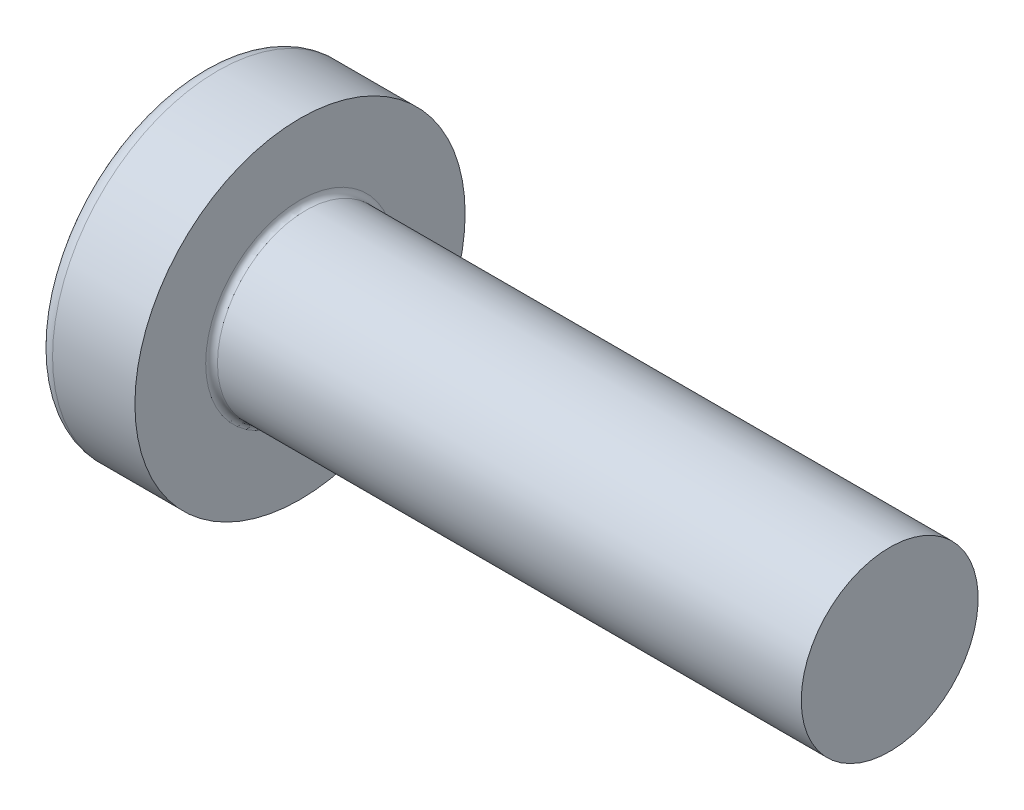
ISO-10303-21;
HEADER;
FILE_DESCRIPTION(('STEP AP214'),'2;1');
FILE_NAME('part.step','',(''),(''),'','','');
FILE_SCHEMA(('AUTOMOTIVE_DESIGN { 1 0 10303 214 1 1 1 1 }'));
ENDSEC;
DATA;
#1=APPLICATION_CONTEXT('core data for automotive mechanical design processes');
#2=APPLICATION_PROTOCOL_DEFINITION('international standard','automotive_design',2000,#1);
#3=PRODUCT_CONTEXT('',#1,'mechanical');
#4=PRODUCT('Part','Part','',(#3));
#5=PRODUCT_RELATED_PRODUCT_CATEGORY('part','',(#4));
#6=PRODUCT_DEFINITION_FORMATION('','',#4);
#7=PRODUCT_DEFINITION_CONTEXT('part definition',#1,'design');
#8=PRODUCT_DEFINITION('design','',#6,#7);
#9=PRODUCT_DEFINITION_SHAPE('','',#8);
#10=(LENGTH_UNIT() NAMED_UNIT(*) SI_UNIT(.MILLI.,.METRE.));
#11=(NAMED_UNIT(*) PLANE_ANGLE_UNIT() SI_UNIT($,.RADIAN.));
#12=(NAMED_UNIT(*) SI_UNIT($,.STERADIAN.) SOLID_ANGLE_UNIT());
#13=UNCERTAINTY_MEASURE_WITH_UNIT(LENGTH_MEASURE(1.E-05),#10,'distance_accuracy_value','');
#14=(GEOMETRIC_REPRESENTATION_CONTEXT(3) GLOBAL_UNCERTAINTY_ASSIGNED_CONTEXT((#13)) GLOBAL_UNIT_ASSIGNED_CONTEXT((#10,
#11,#12)) REPRESENTATION_CONTEXT('',''));
#15=CARTESIAN_POINT('',(0.,0.,0.));
#16=DIRECTION('',(0.,0.,1.));
#17=DIRECTION('',(1.,0.,0.));
#18=AXIS2_PLACEMENT_3D('',#15,#16,#17);
#19=CARTESIAN_POINT('',(5.,0.,0.));
#20=DIRECTION('',(-1.,0.,0.));
#21=DIRECTION('',(0.,1.,0.));
#22=AXIS2_PLACEMENT_3D('',#19,#20,#21);
#23=SPHERICAL_SURFACE('',#22,5.);
#24=CARTESIAN_POINT('',(0.775371598933733,0.,0.));
#25=DIRECTION('',(-1.,0.,0.));
#26=DIRECTION('',(0.,0.,1.));
#27=AXIS2_PLACEMENT_3D('',#24,#25,#26);
#28=CIRCLE('',#27,2.67441860465116);
#29=CARTESIAN_POINT('',(0.775371598933733,0.,2.67441860465116));
#30=VERTEX_POINT('',#29);
#31=EDGE_CURVE('E238',#30,#30,#28,.T.);
#32=ORIENTED_EDGE('',*,*,#31,.T.);
#33=EDGE_LOOP('',(#32));
#34=FACE_BOUND('',#33,.T.);
#35=CARTESIAN_POINT('',(0.0457951200896417,0.,0.));
#36=DIRECTION('',(1.,0.,0.));
#37=DIRECTION('',(0.,0.,-1.));
#38=AXIS2_PLACEMENT_3D('',#35,#36,#37);
#39=CIRCLE('',#38,0.675169614150692);
#40=CARTESIAN_POINT('',(0.0457951200896417,-0.369999999999997,-0.564760133040919));
#41=VERTEX_POINT('',#40);
#42=CARTESIAN_POINT('',(0.0457951200896417,-0.564760133040924,-0.37));
#43=VERTEX_POINT('',#42);
#44=EDGE_CURVE('E374',#41,#43,#39,.F.);
#45=ORIENTED_EDGE('',*,*,#44,.F.);
#46=CARTESIAN_POINT('',(5.,-0.370000000000002,0.));
#47=DIRECTION('',(0.,1.,0.));
#48=DIRECTION('',(0.,0.,1.));
#49=AXIS2_PLACEMENT_3D('',#46,#47,#48);
#50=CIRCLE('',#49,4.98629120689917);
#51=CARTESIAN_POINT('',(0.187869734228639,-0.369999999999995,-1.30633162146802));
#52=VERTEX_POINT('',#51);
#53=EDGE_CURVE('E300',#52,#41,#50,.T.);
#54=ORIENTED_EDGE('',*,*,#53,.F.);
#55=CARTESIAN_POINT('',(4.56358262530798,0.,0.875317983305919));
#56=DIRECTION('',(0.446197753347436,0.,-0.894934391398443));
#57=DIRECTION('',(-0.894934391398443,0.,-0.446197753347436));
#58=AXIS2_PLACEMENT_3D('',#55,#56,#57);
#59=CIRCLE('',#58,4.90340272700175);
#60=CARTESIAN_POINT('',(0.187869734228639,0.370000000000005,-1.30633162146802));
#61=VERTEX_POINT('',#60);
#62=EDGE_CURVE('E272',#52,#61,#59,.T.);
#63=ORIENTED_EDGE('',*,*,#62,.T.);
#64=CARTESIAN_POINT('',(5.,0.369999999999999,0.));
#65=DIRECTION('',(0.,-1.,0.));
#66=DIRECTION('',(0.,0.,-1.));
#67=AXIS2_PLACEMENT_3D('',#64,#65,#66);
#68=CIRCLE('',#67,4.98629120689917);
#69=CARTESIAN_POINT('',(0.0457951200896424,0.370000000000002,-0.564760133040916));
#70=VERTEX_POINT('',#69);
#71=EDGE_CURVE('E327',#70,#61,#68,.T.);
#72=ORIENTED_EDGE('',*,*,#71,.F.);
#73=CARTESIAN_POINT('',(0.0457951200896417,0.564760133040913,-0.37));
#74=VERTEX_POINT('',#73);
#75=EDGE_CURVE('E393',#74,#70,#39,.F.);
#76=ORIENTED_EDGE('',*,*,#75,.F.);
#77=CARTESIAN_POINT('',(5.,0.,-0.369999999999999));
#78=DIRECTION('',(0.,0.,1.));
#79=DIRECTION('',(1.,0.,0.));
#80=AXIS2_PLACEMENT_3D('',#77,#78,#79);
#81=CIRCLE('',#80,4.98629120689917);
#82=CARTESIAN_POINT('',(0.187869734228641,1.30633162146802,-0.37));
#83=VERTEX_POINT('',#82);
#84=EDGE_CURVE('E266',#83,#74,#81,.T.);
#85=ORIENTED_EDGE('',*,*,#84,.F.);
#86=CARTESIAN_POINT('',(4.56358262530798,-0.875317983305921,0.));
#87=DIRECTION('',(0.446197753347436,0.894934391398443,0.));
#88=DIRECTION('',(-0.894934391398443,0.446197753347436,0.));
#89=AXIS2_PLACEMENT_3D('',#86,#87,#88);
#90=CIRCLE('',#89,4.90340272700175);
#91=CARTESIAN_POINT('',(0.187869734228641,1.30633162146802,0.370000000000001));
#92=VERTEX_POINT('',#91);
#93=EDGE_CURVE('E269',#83,#92,#90,.T.);
#94=ORIENTED_EDGE('',*,*,#93,.T.);
#95=CARTESIAN_POINT('',(5.,0.,0.370000000000002));
#96=DIRECTION('',(0.,0.,-1.));
#97=DIRECTION('',(-1.,0.,0.));
#98=AXIS2_PLACEMENT_3D('',#95,#96,#97);
#99=CIRCLE('',#98,4.98629120689917);
#100=CARTESIAN_POINT('',(0.0457951200896417,0.564760133040909,0.369999999999999));
#101=VERTEX_POINT('',#100);
#102=EDGE_CURVE('E262',#101,#92,#99,.T.);
#103=ORIENTED_EDGE('',*,*,#102,.F.);
#104=CARTESIAN_POINT('',(0.0457951200896434,0.369999999999998,0.564760133040918));
#105=VERTEX_POINT('',#104);
#106=EDGE_CURVE('E431',#105,#101,#39,.F.);
#107=ORIENTED_EDGE('',*,*,#106,.F.);
#108=CARTESIAN_POINT('',(0.18786973422864,0.369999999999995,1.30633162146802));
#109=VERTEX_POINT('',#108);
#110=EDGE_CURVE('E282',#109,#105,#68,.T.);
#111=ORIENTED_EDGE('',*,*,#110,.F.);
#112=CARTESIAN_POINT('',(4.56358262530798,0.,-0.87531798330592));
#113=DIRECTION('',(0.446197753347436,0.,0.894934391398443));
#114=DIRECTION('',(0.894934391398443,0.,-0.446197753347436));
#115=AXIS2_PLACEMENT_3D('',#112,#113,#114);
#116=CIRCLE('',#115,4.90340272700175);
#117=CARTESIAN_POINT('',(0.187869734228639,-0.370000000000006,1.30633162146802));
#118=VERTEX_POINT('',#117);
#119=EDGE_CURVE('E49',#109,#118,#116,.T.);
#120=ORIENTED_EDGE('',*,*,#119,.T.);
#121=CARTESIAN_POINT('',(0.0457951200896408,-0.370000000000001,0.564760133040917));
#122=VERTEX_POINT('',#121);
#123=EDGE_CURVE('E279',#122,#118,#50,.T.);
#124=ORIENTED_EDGE('',*,*,#123,.F.);
#125=CARTESIAN_POINT('',(0.0457951200896417,-0.56476013304092,0.369999999999999));
#126=VERTEX_POINT('',#125);
#127=EDGE_CURVE('E392',#126,#122,#39,.F.);
#128=ORIENTED_EDGE('',*,*,#127,.F.);
#129=CARTESIAN_POINT('',(0.187869734228638,-1.30633162146802,0.369999999999999));
#130=VERTEX_POINT('',#129);
#131=EDGE_CURVE('E263',#130,#126,#99,.T.);
#132=ORIENTED_EDGE('',*,*,#131,.F.);
#133=CARTESIAN_POINT('',(4.56358262530798,0.875317983305917,0.));
#134=DIRECTION('',(0.446197753347436,-0.894934391398443,0.));
#135=DIRECTION('',(0.894934391398443,0.446197753347436,0.));
#136=AXIS2_PLACEMENT_3D('',#133,#134,#135);
#137=CIRCLE('',#136,4.90340272700175);
#138=CARTESIAN_POINT('',(0.187869734228638,-1.30633162146802,-0.37));
#139=VERTEX_POINT('',#138);
#140=EDGE_CURVE('E259',#130,#139,#137,.T.);
#141=ORIENTED_EDGE('',*,*,#140,.T.);
#142=EDGE_CURVE('E64',#43,#139,#81,.T.);
#143=ORIENTED_EDGE('',*,*,#142,.F.);
#144=EDGE_LOOP('',(#45,#54,#63,#72,#76,#85,#94,#103,#107,#111,#120,#124,#128,#132,#141,#143));
#145=FACE_BOUND('',#144,.T.);
#146=ADVANCED_FACE('F35',(#34,#145),#23,.T.);
#147=CARTESIAN_POINT('',(1.75,0.527482331818931,-0.37));
#148=DIRECTION('',(0.,0.,1.));
#149=DIRECTION('',(1.,0.,0.));
#150=AXIS2_PLACEMENT_3D('',#147,#148,#149);
#151=PLANE('',#150);
#152=ORIENTED_EDGE('',*,*,#84,.T.);
#153=CARTESIAN_POINT('',(-0.987293237069636,0.649401255968442,-0.37));
#154=CARTESIAN_POINT('',(-0.781914975331302,0.632865887004023,-0.37));
#155=CARTESIAN_POINT('',(-0.576547882405889,0.616188977636102,-0.37));
#156=CARTESIAN_POINT('',(-0.165841599235441,0.582441031964983,-0.37));
#157=CARTESIAN_POINT('',(0.0394975903016328,0.5653699870555,-0.37));
#158=CARTESIAN_POINT('',(0.4501334754206,0.530723441326706,-0.37));
#159=CARTESIAN_POINT('',(0.65543017101234,0.513147940624409,-0.37));
#160=CARTESIAN_POINT('',(1.06596140178858,0.477314957984981,-0.37));
#161=CARTESIAN_POINT('',(1.27119593782008,0.459057485804908,-0.37));
#162=CARTESIAN_POINT('',(1.61065292367297,0.428051938687225,-0.37));
#163=CARTESIAN_POINT('',(1.74490059997313,0.415580824989367,-0.37));
#164=CARTESIAN_POINT('',(2.01334321764434,0.390092023403371,-0.37));
#165=CARTESIAN_POINT('',(2.14753815936247,0.377074339175719,-0.37));
#166=CARTESIAN_POINT('',(2.41586354153627,0.350315629451146,-0.37));
#167=CARTESIAN_POINT('',(2.54999397846979,0.336574568175918,-0.37));
#168=CARTESIAN_POINT('',(2.8181417329714,0.308004077740054,-0.37));
#169=CARTESIAN_POINT('',(2.95215904766802,0.29317462174519,-0.37));
#170=CARTESIAN_POINT('',(3.08609550685347,0.277618485069874,-0.37));
#171=B_SPLINE_CURVE_WITH_KNOTS('',3,(#153,#154,#155,#156,#157,#158,#159,#160,#161,#162,#163,
#164,#165,#166,#167,#168,#169,#170),.UNSPECIFIED.,.F.,.F.,(4,2,2,2,2,2,2,2,4),(0.,
0.61812879398981,1.23627109813549,1.85441325889711,2.47254657920086,2.87702276221884,
3.28149623681437,3.68598973554218,4.09049321035586),.UNSPECIFIED.);
#172=CARTESIAN_POINT('',(1.75,0.415013252800437,-0.37));
#173=VERTEX_POINT('',#172);
#174=EDGE_CURVE('E416',#74,#173,#171,.T.);
#175=ORIENTED_EDGE('',*,*,#174,.T.);
#176=DIRECTION('',(0.,1.,0.));
#177=VECTOR('',#176,1.);
#178=CARTESIAN_POINT('',(1.75,-0.527482331818932,-0.37));
#179=LINE('',#178,#177);
#180=CARTESIAN_POINT('',(1.75,0.527482331818931,-0.37));
#181=VERTEX_POINT('',#180);
#182=EDGE_CURVE('E356',#173,#181,#179,.T.);
#183=ORIENTED_EDGE('',*,*,#182,.T.);
#184=DIRECTION('',(0.894934391398442,-0.446197753347436,0.));
#185=VECTOR('',#184,1.);
#186=CARTESIAN_POINT('',(0.,1.4,-0.37));
#187=LINE('',#186,#185);
#188=EDGE_CURVE('E239',#83,#181,#187,.T.);
#189=ORIENTED_EDGE('',*,*,#188,.F.);
#190=EDGE_LOOP('',(#152,#175,#183,#189));
#191=FACE_BOUND('',#190,.T.);
#192=ADVANCED_FACE('F194',(#191),#151,.T.);
#193=CARTESIAN_POINT('',(1.75,-0.527482331818932,-0.37));
#194=VERTEX_POINT('',#193);
#195=CARTESIAN_POINT('',(1.75,-0.415013252800437,-0.37));
#196=VERTEX_POINT('',#195);
#197=EDGE_CURVE('E247',#194,#196,#179,.T.);
#198=ORIENTED_EDGE('',*,*,#197,.T.);
#199=CARTESIAN_POINT('',(-0.987293237069636,-0.649401255968442,-0.37));
#200=CARTESIAN_POINT('',(-0.781914975331303,-0.632865887004023,-0.37));
#201=CARTESIAN_POINT('',(-0.57654788240589,-0.616188977636102,-0.37));
#202=CARTESIAN_POINT('',(-0.165841599235441,-0.582441031964983,-0.37));
#203=CARTESIAN_POINT('',(0.0394975903016326,-0.5653699870555,-0.37));
#204=CARTESIAN_POINT('',(0.4501334754206,-0.530723441326706,-0.37));
#205=CARTESIAN_POINT('',(0.65543017101234,-0.513147940624409,-0.37));
#206=CARTESIAN_POINT('',(1.06596140178858,-0.477314957984981,-0.37));
#207=CARTESIAN_POINT('',(1.27119593782008,-0.459057485804908,-0.37));
#208=CARTESIAN_POINT('',(1.61065292367297,-0.428051938687225,-0.37));
#209=CARTESIAN_POINT('',(1.74490059997313,-0.415580824989368,-0.37));
#210=CARTESIAN_POINT('',(2.01334321764433,-0.390092023403371,-0.37));
#211=CARTESIAN_POINT('',(2.14753815936247,-0.377074339175718,-0.37));
#212=CARTESIAN_POINT('',(2.41586354153627,-0.350315629451146,-0.37));
#213=CARTESIAN_POINT('',(2.54999397846979,-0.336574568175918,-0.37));
#214=CARTESIAN_POINT('',(2.8181417329714,-0.308004077740054,-0.37));
#215=CARTESIAN_POINT('',(2.95215904766802,-0.29317462174519,-0.37));
#216=CARTESIAN_POINT('',(3.08609550685347,-0.277618485069873,-0.37));
#217=B_SPLINE_CURVE_WITH_KNOTS('',3,(#199,#200,#201,#202,#203,#204,#205,#206,#207,#208,#209,
#210,#211,#212,#213,#214,#215,#216),.UNSPECIFIED.,.F.,.F.,(4,2,2,2,2,2,2,2,4),(0.,
0.61812879398981,1.2362710981355,1.85441325889711,2.47254657920086,2.87702276221884,
3.28149623681437,3.68598973554218,4.09049321035587),.UNSPECIFIED.);
#218=EDGE_CURVE('E391',#196,#43,#217,.F.);
#219=ORIENTED_EDGE('',*,*,#218,.T.);
#220=ORIENTED_EDGE('',*,*,#142,.T.);
#221=DIRECTION('',(0.894934391398443,0.446197753347436,0.));
#222=VECTOR('',#221,1.);
#223=CARTESIAN_POINT('',(0.,-1.4,-0.37));
#224=LINE('',#223,#222);
#225=EDGE_CURVE('E330',#139,#194,#224,.T.);
#226=ORIENTED_EDGE('',*,*,#225,.T.);
#227=EDGE_LOOP('',(#198,#219,#220,#226));
#228=FACE_BOUND('',#227,.T.);
#229=ADVANCED_FACE('F200',(#228),#151,.T.);
#230=CARTESIAN_POINT('',(1.75,-0.527482331818932,0.37));
#231=DIRECTION('',(0.,0.,-1.));
#232=DIRECTION('',(-1.,0.,0.));
#233=AXIS2_PLACEMENT_3D('',#230,#231,#232);
#234=PLANE('',#233);
#235=DIRECTION('',(0.,-1.,0.));
#236=VECTOR('',#235,1.);
#237=CARTESIAN_POINT('',(1.75,0.527482331818931,0.37));
#238=LINE('',#237,#236);
#239=CARTESIAN_POINT('',(1.75,0.527482331818931,0.37));
#240=VERTEX_POINT('',#239);
#241=CARTESIAN_POINT('',(1.75,0.415013252800437,0.37));
#242=VERTEX_POINT('',#241);
#243=EDGE_CURVE('E339',#240,#242,#238,.T.);
#244=ORIENTED_EDGE('',*,*,#243,.T.);
#245=CARTESIAN_POINT('',(-0.987293237053716,0.649401255967162,0.369999999999998));
#246=CARTESIAN_POINT('',(-0.781914975317084,0.632865887002872,0.369999999999998));
#247=CARTESIAN_POINT('',(-0.576547882393372,0.616188977635082,0.369999999999998));
#248=CARTESIAN_POINT('',(-0.165841599226327,0.582441031964228,0.369999999999999));
#249=CARTESIAN_POINT('',(0.0394975903090454,0.56536998705488,0.369999999999999));
#250=CARTESIAN_POINT('',(0.450133475422572,0.530723441326535,0.369999999999999));
#251=CARTESIAN_POINT('',(0.655430171010573,0.513147940624557,0.369999999999999));
#252=CARTESIAN_POINT('',(1.06596140177934,0.477314957985794,0.37));
#253=CARTESIAN_POINT('',(1.2711959378071,0.459057485806066,0.37));
#254=CARTESIAN_POINT('',(1.61065292365626,0.428051938688769,0.37));
#255=CARTESIAN_POINT('',(1.74490059995643,0.415580824990931,0.37));
#256=CARTESIAN_POINT('',(2.01334321762763,0.390092023404979,0.37));
#257=CARTESIAN_POINT('',(2.14753815934577,0.377074339177353,0.37));
#258=CARTESIAN_POINT('',(2.41586354151957,0.350315629452842,0.37));
#259=CARTESIAN_POINT('',(2.5499939784531,0.336574568177649,0.370000000000001));
#260=CARTESIAN_POINT('',(2.81814173295471,0.308004077741874,0.370000000000001));
#261=CARTESIAN_POINT('',(2.95215904765134,0.293174621747063,0.370000000000001));
#262=CARTESIAN_POINT('',(3.0860955068368,0.277618485071814,0.370000000000001));
#263=B_SPLINE_CURVE_WITH_KNOTS('',3,(#245,#246,#247,#248,#249,#250,#251,#252,#253,#254,#255,
#256,#257,#258,#259,#260,#261,#262),.UNSPECIFIED.,.F.,.F.,(4,2,2,2,2,2,2,2,4),(0.,
0.618128793984691,1.23627109812525,1.85441325887562,2.4725465791681,2.87702276218609,
3.28149623678161,3.68598973550942,4.09049321032311),.UNSPECIFIED.);
#264=EDGE_CURVE('E432',#242,#101,#263,.F.);
#265=ORIENTED_EDGE('',*,*,#264,.T.);
#266=ORIENTED_EDGE('',*,*,#102,.T.);
#267=DIRECTION('',(0.894934391398442,-0.446197753347436,0.));
#268=VECTOR('',#267,1.);
#269=CARTESIAN_POINT('',(0.,1.4,0.37));
#270=LINE('',#269,#268);
#271=EDGE_CURVE('E244',#92,#240,#270,.T.);
#272=ORIENTED_EDGE('',*,*,#271,.T.);
#273=EDGE_LOOP('',(#244,#265,#266,#272));
#274=FACE_BOUND('',#273,.T.);
#275=ADVANCED_FACE('F412',(#274),#234,.T.);
#276=ORIENTED_EDGE('',*,*,#131,.T.);
#277=CARTESIAN_POINT('',(-0.987293237053716,-0.649401255967162,0.369999999999998));
#278=CARTESIAN_POINT('',(-0.781914975317084,-0.632865887002872,0.369999999999998));
#279=CARTESIAN_POINT('',(-0.576547882393373,-0.616188977635082,0.369999999999999));
#280=CARTESIAN_POINT('',(-0.165841599226327,-0.582441031964228,0.369999999999999));
#281=CARTESIAN_POINT('',(0.0394975903090454,-0.56536998705488,0.369999999999999));
#282=CARTESIAN_POINT('',(0.450133475422572,-0.530723441326535,0.369999999999999));
#283=CARTESIAN_POINT('',(0.655430171010573,-0.513147940624557,0.369999999999999));
#284=CARTESIAN_POINT('',(1.06596140177934,-0.477314957985794,0.37));
#285=CARTESIAN_POINT('',(1.2711959378071,-0.459057485806066,0.37));
#286=CARTESIAN_POINT('',(1.61065292365626,-0.428051938688769,0.37));
#287=CARTESIAN_POINT('',(1.74490059995643,-0.415580824990931,0.37));
#288=CARTESIAN_POINT('',(2.01334321762763,-0.390092023404979,0.37));
#289=CARTESIAN_POINT('',(2.14753815934577,-0.377074339177353,0.37));
#290=CARTESIAN_POINT('',(2.41586354151957,-0.350315629452842,0.370000000000001));
#291=CARTESIAN_POINT('',(2.5499939784531,-0.336574568177649,0.370000000000001));
#292=CARTESIAN_POINT('',(2.81814173295471,-0.308004077741874,0.370000000000001));
#293=CARTESIAN_POINT('',(2.95215904765134,-0.293174621747064,0.370000000000001));
#294=CARTESIAN_POINT('',(3.0860955068368,-0.277618485071814,0.370000000000001));
#295=B_SPLINE_CURVE_WITH_KNOTS('',3,(#277,#278,#279,#280,#281,#282,#283,#284,#285,#286,#287,
#288,#289,#290,#291,#292,#293,#294),.UNSPECIFIED.,.F.,.F.,(4,2,2,2,2,2,2,2,4),(0.,
0.618128793984691,1.23627109812525,1.85441325887562,2.4725465791681,2.87702276218609,
3.28149623678161,3.68598973550942,4.09049321032311),.UNSPECIFIED.);
#296=CARTESIAN_POINT('',(1.75,-0.415013252800437,0.370000000000001));
#297=VERTEX_POINT('',#296);
#298=EDGE_CURVE('E453',#126,#297,#295,.T.);
#299=ORIENTED_EDGE('',*,*,#298,.T.);
#300=CARTESIAN_POINT('',(1.75,-0.527482331818932,0.37));
#301=VERTEX_POINT('',#300);
#302=EDGE_CURVE('E341',#297,#301,#238,.T.);
#303=ORIENTED_EDGE('',*,*,#302,.T.);
#304=DIRECTION('',(0.894934391398443,0.446197753347436,0.));
#305=VECTOR('',#304,1.);
#306=CARTESIAN_POINT('',(0.,-1.4,0.369999999999999));
#307=LINE('',#306,#305);
#308=EDGE_CURVE('E332',#130,#301,#307,.T.);
#309=ORIENTED_EDGE('',*,*,#308,.F.);
#310=EDGE_LOOP('',(#276,#299,#303,#309));
#311=FACE_BOUND('',#310,.T.);
#312=ADVANCED_FACE('F515',(#311),#234,.T.);
#313=CARTESIAN_POINT('',(1.75,0.527482331818931,0.37));
#314=DIRECTION('',(0.446197753347436,0.894934391398443,0.));
#315=DIRECTION('',(-0.894934391398443,0.446197753347436,0.));
#316=AXIS2_PLACEMENT_3D('',#313,#314,#315);
#317=PLANE('',#316);
#318=CARTESIAN_POINT('',(2.6696526882832,0.0689604923233255,0.));
#319=DIRECTION('',(0.446197753347436,0.894934391398443,0.));
#320=DIRECTION('',(-0.894934391398443,0.446197753347436,0.));
#321=AXIS2_PLACEMENT_3D('',#318,#319,#320);
#322=ELLIPSE('',#321,1.10195897609153,0.486831694838766);
#323=CARTESIAN_POINT('',(1.75,0.527482331818932,0.175779377683682));
#324=VERTEX_POINT('',#323);
#325=CARTESIAN_POINT('',(1.75,0.527482331818932,-0.175779377683682));
#326=VERTEX_POINT('',#325);
#327=EDGE_CURVE('E305',#324,#326,#322,.F.);
#328=ORIENTED_EDGE('',*,*,#327,.F.);
#329=DIRECTION('',(0.,0.,-1.));
#330=VECTOR('',#329,1.);
#331=CARTESIAN_POINT('',(1.75,0.527482331818931,0.37));
#332=LINE('',#331,#330);
#333=EDGE_CURVE('E342',#240,#324,#332,.T.);
#334=ORIENTED_EDGE('',*,*,#333,.F.);
#335=ORIENTED_EDGE('',*,*,#271,.F.);
#336=ORIENTED_EDGE('',*,*,#93,.F.);
#337=ORIENTED_EDGE('',*,*,#188,.T.);
#338=EDGE_CURVE('E344',#326,#181,#332,.T.);
#339=ORIENTED_EDGE('',*,*,#338,.F.);
#340=EDGE_LOOP('',(#328,#334,#335,#336,#337,#339));
#341=FACE_BOUND('',#340,.T.);
#342=ADVANCED_FACE('F410',(#341),#317,.F.);
#343=CARTESIAN_POINT('',(1.75,-0.527482331818932,-0.37));
#344=DIRECTION('',(0.446197753347436,-0.894934391398443,0.));
#345=DIRECTION('',(0.894934391398443,0.446197753347436,0.));
#346=AXIS2_PLACEMENT_3D('',#343,#344,#345);
#347=PLANE('',#346);
#348=CARTESIAN_POINT('',(2.6696526882832,-0.0689604923233255,0.));
#349=DIRECTION('',(0.446197753347436,-0.894934391398443,0.));
#350=DIRECTION('',(-0.894934391398443,-0.446197753347436,0.));
#351=AXIS2_PLACEMENT_3D('',#348,#349,#350);
#352=ELLIPSE('',#351,1.10195897609154,0.486831694838766);
#353=CARTESIAN_POINT('',(1.75,-0.527482331818932,-0.175779377683679));
#354=VERTEX_POINT('',#353);
#355=CARTESIAN_POINT('',(1.75,-0.527482331818932,0.175779377683679));
#356=VERTEX_POINT('',#355);
#357=EDGE_CURVE('E459',#354,#356,#352,.F.);
#358=ORIENTED_EDGE('',*,*,#357,.F.);
#359=DIRECTION('',(0.,0.,1.));
#360=VECTOR('',#359,1.);
#361=CARTESIAN_POINT('',(1.75,-0.527482331818932,-0.37));
#362=LINE('',#361,#360);
#363=EDGE_CURVE('E335',#194,#354,#362,.T.);
#364=ORIENTED_EDGE('',*,*,#363,.F.);
#365=ORIENTED_EDGE('',*,*,#225,.F.);
#366=ORIENTED_EDGE('',*,*,#140,.F.);
#367=ORIENTED_EDGE('',*,*,#308,.T.);
#368=EDGE_CURVE('E338',#356,#301,#362,.T.);
#369=ORIENTED_EDGE('',*,*,#368,.F.);
#370=EDGE_LOOP('',(#358,#364,#365,#366,#367,#369));
#371=FACE_BOUND('',#370,.T.);
#372=ADVANCED_FACE('F507',(#371),#347,.F.);
#373=CARTESIAN_POINT('',(1.75,-0.527482331818932,-0.37));
#374=DIRECTION('',(1.,0.,0.));
#375=DIRECTION('',(0.,0.,-1.));
#376=AXIS2_PLACEMENT_3D('',#373,#374,#375);
#377=PLANE('',#376);
#378=CARTESIAN_POINT('',(1.75,0.,0.));
#379=DIRECTION('',(-1.,0.,0.));
#380=DIRECTION('',(0.,0.,1.));
#381=AXIS2_PLACEMENT_3D('',#378,#379,#380);
#382=CIRCLE('',#381,0.556);
#383=CARTESIAN_POINT('',(1.75,-0.175779377683679,-0.527482331818933));
#384=VERTEX_POINT('',#383);
#385=CARTESIAN_POINT('',(1.75,-0.369999999999999,-0.415013252800438));
#386=VERTEX_POINT('',#385);
#387=EDGE_CURVE('E56',#384,#386,#382,.T.);
#388=ORIENTED_EDGE('',*,*,#387,.F.);
#389=DIRECTION('',(0.,-1.,0.));
#390=VECTOR('',#389,1.);
#391=CARTESIAN_POINT('',(1.75,0.370000000000002,-0.527482331818931));
#392=LINE('',#391,#390);
#393=CARTESIAN_POINT('',(1.75,-0.369999999999998,-0.527482331818933));
#394=VERTEX_POINT('',#393);
#395=EDGE_CURVE('E315',#384,#394,#392,.T.);
#396=ORIENTED_EDGE('',*,*,#395,.T.);
#397=DIRECTION('',(0.,0.,-1.));
#398=VECTOR('',#397,1.);
#399=CARTESIAN_POINT('',(1.75,-0.370000000000002,0.52748233181893));
#400=LINE('',#399,#398);
#401=EDGE_CURVE('E319',#386,#394,#400,.T.);
#402=ORIENTED_EDGE('',*,*,#401,.F.);
#403=EDGE_LOOP('',(#388,#396,#402));
#404=FACE_BOUND('',#403,.T.);
#405=ADVANCED_FACE('F380',(#404),#377,.F.);
#406=EDGE_CURVE('E385',#196,#354,#382,.T.);
#407=ORIENTED_EDGE('',*,*,#406,.F.);
#408=ORIENTED_EDGE('',*,*,#197,.F.);
#409=ORIENTED_EDGE('',*,*,#363,.T.);
#410=EDGE_LOOP('',(#407,#408,#409));
#411=FACE_BOUND('',#410,.T.);
#412=ADVANCED_FACE('F514',(#411),#377,.F.);
#413=EDGE_CURVE('E522',#356,#297,#382,.T.);
#414=ORIENTED_EDGE('',*,*,#413,.F.);
#415=ORIENTED_EDGE('',*,*,#368,.T.);
#416=ORIENTED_EDGE('',*,*,#302,.F.);
#417=EDGE_LOOP('',(#414,#415,#416));
#418=FACE_BOUND('',#417,.T.);
#419=ADVANCED_FACE('F503',(#418),#377,.F.);
#420=CARTESIAN_POINT('',(1.75,-0.370000000000001,0.415013252800436));
#421=VERTEX_POINT('',#420);
#422=CARTESIAN_POINT('',(1.75,-0.175779377683685,0.527482331818931));
#423=VERTEX_POINT('',#422);
#424=EDGE_CURVE('E490',#421,#423,#382,.T.);
#425=ORIENTED_EDGE('',*,*,#424,.F.);
#426=CARTESIAN_POINT('',(1.75,-0.370000000000002,0.52748233181893));
#427=VERTEX_POINT('',#426);
#428=EDGE_CURVE('E316',#427,#421,#400,.T.);
#429=ORIENTED_EDGE('',*,*,#428,.F.);
#430=DIRECTION('',(0.,1.,0.));
#431=VECTOR('',#430,1.);
#432=CARTESIAN_POINT('',(1.75,-0.370000000000002,0.52748233181893));
#433=LINE('',#432,#431);
#434=EDGE_CURVE('E320',#427,#423,#433,.T.);
#435=ORIENTED_EDGE('',*,*,#434,.T.);
#436=EDGE_LOOP('',(#425,#429,#435));
#437=FACE_BOUND('',#436,.T.);
#438=ADVANCED_FACE('F488',(#437),#377,.F.);
#439=CARTESIAN_POINT('',(1.75,0.175779377683682,0.527482331818932));
#440=VERTEX_POINT('',#439);
#441=CARTESIAN_POINT('',(1.75,0.369999999999998,0.415013252800439));
#442=VERTEX_POINT('',#441);
#443=EDGE_CURVE('E386',#440,#442,#382,.T.);
#444=ORIENTED_EDGE('',*,*,#443,.F.);
#445=CARTESIAN_POINT('',(1.75,0.369999999999998,0.527482331818932));
#446=VERTEX_POINT('',#445);
#447=EDGE_CURVE('E323',#440,#446,#433,.T.);
#448=ORIENTED_EDGE('',*,*,#447,.T.);
#449=DIRECTION('',(0.,0.,1.));
#450=VECTOR('',#449,1.);
#451=CARTESIAN_POINT('',(1.75,0.370000000000002,-0.527482331818931));
#452=LINE('',#451,#450);
#453=EDGE_CURVE('E297',#442,#446,#452,.T.);
#454=ORIENTED_EDGE('',*,*,#453,.F.);
#455=EDGE_LOOP('',(#444,#448,#454));
#456=FACE_BOUND('',#455,.T.);
#457=ADVANCED_FACE('F496',(#456),#377,.F.);
#458=EDGE_CURVE('E473',#242,#324,#382,.T.);
#459=ORIENTED_EDGE('',*,*,#458,.F.);
#460=ORIENTED_EDGE('',*,*,#243,.F.);
#461=ORIENTED_EDGE('',*,*,#333,.T.);
#462=EDGE_LOOP('',(#459,#460,#461));
#463=FACE_BOUND('',#462,.T.);
#464=ADVANCED_FACE('F498',(#463),#377,.F.);
#465=EDGE_CURVE('E471',#326,#173,#382,.T.);
#466=ORIENTED_EDGE('',*,*,#465,.F.);
#467=ORIENTED_EDGE('',*,*,#338,.T.);
#468=ORIENTED_EDGE('',*,*,#182,.F.);
#469=EDGE_LOOP('',(#466,#467,#468));
#470=FACE_BOUND('',#469,.T.);
#471=ADVANCED_FACE('F443',(#470),#377,.F.);
#472=CARTESIAN_POINT('',(1.75,-0.369999999999998,-0.527482331818933));
#473=DIRECTION('',(0.,1.,0.));
#474=DIRECTION('',(-1.,0.,0.));
#475=AXIS2_PLACEMENT_3D('',#472,#473,#474);
#476=PLANE('',#475);
#477=ORIENTED_EDGE('',*,*,#428,.T.);
#478=CARTESIAN_POINT('',(-0.987293237069635,-0.37,0.649401255968442));
#479=CARTESIAN_POINT('',(-0.781914975331302,-0.37,0.632865887004023));
#480=CARTESIAN_POINT('',(-0.576547882405888,-0.370000000000001,0.616188977636102));
#481=CARTESIAN_POINT('',(-0.16584159923544,-0.370000000000001,0.582441031964982));
#482=CARTESIAN_POINT('',(0.0394975903016338,-0.370000000000001,0.565369987055499));
#483=CARTESIAN_POINT('',(0.450133475420601,-0.370000000000001,0.530723441326705));
#484=CARTESIAN_POINT('',(0.655430171012341,-0.370000000000001,0.513147940624408));
#485=CARTESIAN_POINT('',(1.06596140178858,-0.370000000000001,0.47731495798498));
#486=CARTESIAN_POINT('',(1.27119593782008,-0.370000000000001,0.459057485804906));
#487=CARTESIAN_POINT('',(1.61065292367297,-0.370000000000001,0.428051938687223));
#488=CARTESIAN_POINT('',(1.74490059997313,-0.370000000000001,0.415580824989366));
#489=CARTESIAN_POINT('',(2.01334321764434,-0.370000000000002,0.390092023403369));
#490=CARTESIAN_POINT('',(2.14753815936247,-0.370000000000002,0.377074339175717));
#491=CARTESIAN_POINT('',(2.41586354153627,-0.370000000000002,0.350315629451144));
#492=CARTESIAN_POINT('',(2.54999397846979,-0.370000000000002,0.336574568175916));
#493=CARTESIAN_POINT('',(2.8181417329714,-0.370000000000002,0.308004077740052));
#494=CARTESIAN_POINT('',(2.95215904766802,-0.370000000000002,0.293174621745187));
#495=CARTESIAN_POINT('',(3.08609550685347,-0.370000000000002,0.277618485069871));
#496=B_SPLINE_CURVE_WITH_KNOTS('',3,(#478,#479,#480,#481,#482,#483,#484,#485,#486,#487,#488,
#489,#490,#491,#492,#493,#494,#495),.UNSPECIFIED.,.F.,.F.,(4,2,2,2,2,2,2,2,4),(0.,
0.61812879398981,1.23627109813549,1.85441325889711,2.47254657920086,2.87702276221884,
3.28149623681436,3.68598973554217,4.09049321035586),.UNSPECIFIED.);
#497=EDGE_CURVE('E446',#421,#122,#496,.F.);
#498=ORIENTED_EDGE('',*,*,#497,.T.);
#499=ORIENTED_EDGE('',*,*,#123,.T.);
#500=DIRECTION('',(0.894934391398442,0.,-0.446197753347436));
#501=VECTOR('',#500,1.);
#502=CARTESIAN_POINT('',(0.,-0.370000000000004,1.4));
#503=LINE('',#502,#501);
#504=EDGE_CURVE('E292',#118,#427,#503,.T.);
#505=ORIENTED_EDGE('',*,*,#504,.T.);
#506=EDGE_LOOP('',(#477,#498,#499,#505));
#507=FACE_BOUND('',#506,.T.);
#508=ADVANCED_FACE('F229',(#507),#476,.T.);
#509=CARTESIAN_POINT('',(1.75,0.369999999999998,0.527482331818932));
#510=DIRECTION('',(0.,-1.,0.));
#511=DIRECTION('',(1.,0.,0.));
#512=AXIS2_PLACEMENT_3D('',#509,#510,#511);
#513=PLANE('',#512);
#514=ORIENTED_EDGE('',*,*,#110,.T.);
#515=CARTESIAN_POINT('',(-0.987293237069635,0.369999999999998,0.649401255968443));
#516=CARTESIAN_POINT('',(-0.781914975331301,0.369999999999998,0.632865887004024));
#517=CARTESIAN_POINT('',(-0.576547882405888,0.369999999999998,0.616188977636103));
#518=CARTESIAN_POINT('',(-0.16584159923544,0.369999999999998,0.582441031964984));
#519=CARTESIAN_POINT('',(0.0394975903016336,0.369999999999998,0.565369987055501));
#520=CARTESIAN_POINT('',(0.450133475420601,0.369999999999998,0.530723441326707));
#521=CARTESIAN_POINT('',(0.655430171012341,0.369999999999998,0.51314794062441));
#522=CARTESIAN_POINT('',(1.06596140178858,0.369999999999998,0.477314957984982));
#523=CARTESIAN_POINT('',(1.27119593782008,0.369999999999998,0.459057485804909));
#524=CARTESIAN_POINT('',(1.61065292367297,0.369999999999998,0.428051938687226));
#525=CARTESIAN_POINT('',(1.74490059997313,0.369999999999998,0.415580824989369));
#526=CARTESIAN_POINT('',(2.01334321764434,0.369999999999998,0.390092023403372));
#527=CARTESIAN_POINT('',(2.14753815936247,0.369999999999998,0.37707433917572));
#528=CARTESIAN_POINT('',(2.41586354153627,0.369999999999999,0.350315629451147));
#529=CARTESIAN_POINT('',(2.54999397846979,0.369999999999999,0.336574568175919));
#530=CARTESIAN_POINT('',(2.8181417329714,0.369999999999999,0.308004077740055));
#531=CARTESIAN_POINT('',(2.95215904766802,0.369999999999999,0.293174621745191));
#532=CARTESIAN_POINT('',(3.08609550685347,0.369999999999999,0.277618485069875));
#533=B_SPLINE_CURVE_WITH_KNOTS('',3,(#515,#516,#517,#518,#519,#520,#521,#522,#523,#524,#525,
#526,#527,#528,#529,#530,#531,#532),.UNSPECIFIED.,.F.,.F.,(4,2,2,2,2,2,2,2,4),(0.,
0.61812879398981,1.23627109813549,1.85441325889711,2.47254657920086,2.87702276221884,
3.28149623681437,3.68598973554218,4.09049321035586),.UNSPECIFIED.);
#534=EDGE_CURVE('E425',#105,#442,#533,.T.);
#535=ORIENTED_EDGE('',*,*,#534,.T.);
#536=ORIENTED_EDGE('',*,*,#453,.T.);
#537=DIRECTION('',(0.894934391398442,0.,-0.446197753347436));
#538=VECTOR('',#537,1.);
#539=CARTESIAN_POINT('',(0.,0.369999999999995,1.4));
#540=LINE('',#539,#538);
#541=EDGE_CURVE('E290',#109,#446,#540,.T.);
#542=ORIENTED_EDGE('',*,*,#541,.F.);
#543=EDGE_LOOP('',(#514,#535,#536,#542));
#544=FACE_BOUND('',#543,.T.);
#545=ADVANCED_FACE('F294',(#544),#513,.T.);
#546=CARTESIAN_POINT('',(1.75,-0.370000000000002,0.52748233181893));
#547=DIRECTION('',(0.446197753347436,0.,0.894934391398443));
#548=DIRECTION('',(-0.894934391398443,0.,0.446197753347436));
#549=AXIS2_PLACEMENT_3D('',#546,#547,#548);
#550=PLANE('',#549);
#551=CARTESIAN_POINT('',(2.6696526882832,0.,0.0689604923233255));
#552=DIRECTION('',(0.446197753347436,0.,0.894934391398443));
#553=DIRECTION('',(-0.894934391398443,0.,0.446197753347436));
#554=AXIS2_PLACEMENT_3D('',#551,#552,#553);
#555=ELLIPSE('',#554,1.10195897609153,0.486831694838766);
#556=EDGE_CURVE('E423',#423,#440,#555,.F.);
#557=ORIENTED_EDGE('',*,*,#556,.F.);
#558=ORIENTED_EDGE('',*,*,#434,.F.);
#559=ORIENTED_EDGE('',*,*,#504,.F.);
#560=ORIENTED_EDGE('',*,*,#119,.F.);
#561=ORIENTED_EDGE('',*,*,#541,.T.);
#562=ORIENTED_EDGE('',*,*,#447,.F.);
#563=EDGE_LOOP('',(#557,#558,#559,#560,#561,#562));
#564=FACE_BOUND('',#563,.T.);
#565=ADVANCED_FACE('F288',(#564),#550,.F.);
#566=CARTESIAN_POINT('',(1.75,0.370000000000002,-0.527482331818931));
#567=DIRECTION('',(0.446197753347436,0.,-0.894934391398443));
#568=DIRECTION('',(0.894934391398443,0.,0.446197753347436));
#569=AXIS2_PLACEMENT_3D('',#566,#567,#568);
#570=PLANE('',#569);
#571=CARTESIAN_POINT('',(2.6696526882832,0.,-0.0689604923233255));
#572=DIRECTION('',(0.446197753347436,0.,-0.894934391398443));
#573=DIRECTION('',(-0.894934391398443,0.,-0.446197753347436));
#574=AXIS2_PLACEMENT_3D('',#571,#572,#573);
#575=ELLIPSE('',#574,1.10195897609154,0.486831694838766);
#576=CARTESIAN_POINT('',(1.75,0.175779377683683,-0.527482331818931));
#577=VERTEX_POINT('',#576);
#578=EDGE_CURVE('E378',#577,#384,#575,.F.);
#579=ORIENTED_EDGE('',*,*,#578,.F.);
#580=CARTESIAN_POINT('',(1.75,0.370000000000002,-0.527482331818931));
#581=VERTEX_POINT('',#580);
#582=EDGE_CURVE('E312',#581,#577,#392,.T.);
#583=ORIENTED_EDGE('',*,*,#582,.F.);
#584=DIRECTION('',(0.894934391398443,0.,0.446197753347436));
#585=VECTOR('',#584,1.);
#586=CARTESIAN_POINT('',(0.,0.370000000000005,-1.4));
#587=LINE('',#586,#585);
#588=EDGE_CURVE('E302',#61,#581,#587,.T.);
#589=ORIENTED_EDGE('',*,*,#588,.F.);
#590=ORIENTED_EDGE('',*,*,#62,.F.);
#591=DIRECTION('',(0.894934391398443,0.,0.446197753347436));
#592=VECTOR('',#591,1.);
#593=CARTESIAN_POINT('',(0.,-0.369999999999994,-1.4));
#594=LINE('',#593,#592);
#595=EDGE_CURVE('E309',#52,#394,#594,.T.);
#596=ORIENTED_EDGE('',*,*,#595,.T.);
#597=ORIENTED_EDGE('',*,*,#395,.F.);
#598=EDGE_LOOP('',(#579,#583,#589,#590,#596,#597));
#599=FACE_BOUND('',#598,.T.);
#600=ADVANCED_FACE('F369',(#599),#570,.F.);
#601=CARTESIAN_POINT('',(1.75,0.370000000000001,-0.415013252800436));
#602=VERTEX_POINT('',#601);
#603=EDGE_CURVE('E324',#581,#602,#452,.T.);
#604=ORIENTED_EDGE('',*,*,#603,.T.);
#605=CARTESIAN_POINT('',(-0.987293237053717,0.370000000000003,-0.649401255967159));
#606=CARTESIAN_POINT('',(-0.781914975317085,0.370000000000003,-0.63286588700287));
#607=CARTESIAN_POINT('',(-0.576547882393373,0.370000000000003,-0.616188977635079));
#608=CARTESIAN_POINT('',(-0.165841599226328,0.370000000000002,-0.582441031964225));
#609=CARTESIAN_POINT('',(0.0394975903090446,0.370000000000002,-0.565369987054878));
#610=CARTESIAN_POINT('',(0.450133475422571,0.370000000000002,-0.530723441326534));
#611=CARTESIAN_POINT('',(0.655430171010572,0.370000000000002,-0.513147940624555));
#612=CARTESIAN_POINT('',(1.06596140177934,0.370000000000002,-0.477314957985792));
#613=CARTESIAN_POINT('',(1.2711959378071,0.370000000000002,-0.459057485806065));
#614=CARTESIAN_POINT('',(1.61065292365626,0.370000000000001,-0.428051938688767));
#615=CARTESIAN_POINT('',(1.74490059995642,0.370000000000001,-0.415580824990929));
#616=CARTESIAN_POINT('',(2.01334321762763,0.370000000000001,-0.390092023404978));
#617=CARTESIAN_POINT('',(2.14753815934577,0.370000000000001,-0.377074339177352));
#618=CARTESIAN_POINT('',(2.41586354151957,0.370000000000001,-0.350315629452841));
#619=CARTESIAN_POINT('',(2.5499939784531,0.370000000000001,-0.336574568177649));
#620=CARTESIAN_POINT('',(2.81814173295471,0.370000000000001,-0.308004077741874));
#621=CARTESIAN_POINT('',(2.95215904765134,0.370000000000001,-0.293174621747064));
#622=CARTESIAN_POINT('',(3.0860955068368,0.370000000000001,-0.277618485071815));
#623=B_SPLINE_CURVE_WITH_KNOTS('',3,(#605,#606,#607,#608,#609,#610,#611,#612,#613,#614,#615,
#616,#617,#618,#619,#620,#621,#622),.UNSPECIFIED.,.F.,.F.,(4,2,2,2,2,2,2,2,4),(0.,
0.618128793984691,1.23627109812525,1.85441325887562,2.4725465791681,2.87702276218609,
3.28149623678161,3.68598973550942,4.09049321032311),.UNSPECIFIED.);
#624=EDGE_CURVE('E365',#602,#70,#623,.F.);
#625=ORIENTED_EDGE('',*,*,#624,.T.);
#626=ORIENTED_EDGE('',*,*,#71,.T.);
#627=ORIENTED_EDGE('',*,*,#588,.T.);
#628=EDGE_LOOP('',(#604,#625,#626,#627));
#629=FACE_BOUND('',#628,.T.);
#630=ADVANCED_FACE('F227',(#629),#513,.T.);
#631=ORIENTED_EDGE('',*,*,#53,.T.);
#632=CARTESIAN_POINT('',(-0.987293237053718,-0.369999999999996,-0.649401255967163));
#633=CARTESIAN_POINT('',(-0.781914975317086,-0.369999999999996,-0.632865887002874));
#634=CARTESIAN_POINT('',(-0.576547882393374,-0.369999999999996,-0.616188977635083));
#635=CARTESIAN_POINT('',(-0.165841599226328,-0.369999999999997,-0.582441031964229));
#636=CARTESIAN_POINT('',(0.0394975903090439,-0.369999999999997,-0.565369987054882));
#637=CARTESIAN_POINT('',(0.450133475422571,-0.369999999999997,-0.530723441326537));
#638=CARTESIAN_POINT('',(0.655430171010572,-0.369999999999998,-0.513147940624559));
#639=CARTESIAN_POINT('',(1.06596140177933,-0.369999999999998,-0.477314957985796));
#640=CARTESIAN_POINT('',(1.2711959378071,-0.369999999999998,-0.459057485806068));
#641=CARTESIAN_POINT('',(1.61065292365626,-0.369999999999998,-0.42805193868877));
#642=CARTESIAN_POINT('',(1.74490059995642,-0.369999999999999,-0.415580824990932));
#643=CARTESIAN_POINT('',(2.01334321762763,-0.369999999999999,-0.39009202340498));
#644=CARTESIAN_POINT('',(2.14753815934577,-0.369999999999999,-0.377074339177354));
#645=CARTESIAN_POINT('',(2.41586354151957,-0.369999999999999,-0.350315629452843));
#646=CARTESIAN_POINT('',(2.5499939784531,-0.369999999999999,-0.336574568177651));
#647=CARTESIAN_POINT('',(2.81814173295471,-0.37,-0.308004077741875));
#648=CARTESIAN_POINT('',(2.95215904765134,-0.37,-0.293174621747065));
#649=CARTESIAN_POINT('',(3.0860955068368,-0.37,-0.277618485071816));
#650=B_SPLINE_CURVE_WITH_KNOTS('',3,(#632,#633,#634,#635,#636,#637,#638,#639,#640,#641,#642,
#643,#644,#645,#646,#647,#648,#649),.UNSPECIFIED.,.F.,.F.,(4,2,2,2,2,2,2,2,4),(0.,
0.618128793984691,1.23627109812526,1.85441325887562,2.47254657916811,2.87702276218609,
3.28149623678161,3.68598973550942,4.09049321032311),.UNSPECIFIED.);
#651=EDGE_CURVE('E11',#41,#386,#650,.T.);
#652=ORIENTED_EDGE('',*,*,#651,.T.);
#653=ORIENTED_EDGE('',*,*,#401,.T.);
#654=ORIENTED_EDGE('',*,*,#595,.F.);
#655=EDGE_LOOP('',(#631,#652,#653,#654));
#656=FACE_BOUND('',#655,.T.);
#657=ADVANCED_FACE('F222',(#656),#476,.T.);
#658=CARTESIAN_POINT('',(-25.4,0.,0.));
#659=DIRECTION('',(-1.,0.,0.));
#660=DIRECTION('',(0.,0.,1.));
#661=AXIS2_PLACEMENT_3D('',#658,#659,#660);
#662=CYLINDRICAL_SURFACE('',#661,1.5);
#663=CARTESIAN_POINT('',(2.5,0.,0.));
#664=DIRECTION('',(-1.,0.,0.));
#665=DIRECTION('',(0.,0.,1.));
#666=AXIS2_PLACEMENT_3D('',#663,#664,#665);
#667=CIRCLE('',#666,1.5);
#668=CARTESIAN_POINT('',(2.5,0.,1.5));
#669=VERTEX_POINT('',#668);
#670=EDGE_CURVE('E233',#669,#669,#667,.F.);
#671=ORIENTED_EDGE('',*,*,#670,.T.);
#672=EDGE_LOOP('',(#671));
#673=FACE_BOUND('',#672,.T.);
#674=CARTESIAN_POINT('',(12.4,0.,0.));
#675=DIRECTION('',(-1.,0.,0.));
#676=DIRECTION('',(0.,0.,1.));
#677=AXIS2_PLACEMENT_3D('',#674,#675,#676);
#678=CIRCLE('',#677,1.5);
#679=CARTESIAN_POINT('',(12.4,0.,1.5));
#680=VERTEX_POINT('',#679);
#681=EDGE_CURVE('E236',#680,#680,#678,.T.);
#682=ORIENTED_EDGE('',*,*,#681,.T.);
#683=EDGE_LOOP('',(#682));
#684=FACE_BOUND('',#683,.T.);
#685=ADVANCED_FACE('F219',(#673,#684),#662,.T.);
#686=CARTESIAN_POINT('',(2.4,1.5,0.));
#687=DIRECTION('',(-1.,0.,0.));
#688=DIRECTION('',(0.,0.,1.));
#689=AXIS2_PLACEMENT_3D('',#686,#687,#688);
#690=PLANE('',#689);
#691=CARTESIAN_POINT('',(2.4,0.,0.));
#692=DIRECTION('',(-1.,0.,0.));
#693=DIRECTION('',(0.,0.,1.));
#694=AXIS2_PLACEMENT_3D('',#691,#692,#693);
#695=CIRCLE('',#694,1.6);
#696=CARTESIAN_POINT('',(2.4,0.,1.6));
#697=VERTEX_POINT('',#696);
#698=EDGE_CURVE('E255',#697,#697,#695,.T.);
#699=ORIENTED_EDGE('',*,*,#698,.T.);
#700=EDGE_LOOP('',(#699));
#701=FACE_BOUND('',#700,.T.);
#702=CARTESIAN_POINT('',(2.4,0.,0.));
#703=DIRECTION('',(-1.,0.,0.));
#704=DIRECTION('',(0.,0.,1.));
#705=AXIS2_PLACEMENT_3D('',#702,#703,#704);
#706=CIRCLE('',#705,2.8);
#707=CARTESIAN_POINT('',(2.4,0.,2.8));
#708=VERTEX_POINT('',#707);
#709=EDGE_CURVE('E252',#708,#708,#706,.T.);
#710=ORIENTED_EDGE('',*,*,#709,.F.);
#711=EDGE_LOOP('',(#710));
#712=FACE_BOUND('',#711,.T.);
#713=ADVANCED_FACE('F216',(#701,#712),#690,.F.);
#714=CARTESIAN_POINT('',(-25.4,0.,0.));
#715=DIRECTION('',(-1.,0.,0.));
#716=DIRECTION('',(0.,0.,1.));
#717=AXIS2_PLACEMENT_3D('',#714,#715,#716);
#718=CYLINDRICAL_SURFACE('',#717,2.8);
#719=ORIENTED_EDGE('',*,*,#709,.T.);
#720=EDGE_LOOP('',(#719));
#721=FACE_BOUND('',#720,.T.);
#722=CARTESIAN_POINT('',(1.00350153259132,0.,0.));
#723=DIRECTION('',(-1.,0.,0.));
#724=DIRECTION('',(0.,0.,1.));
#725=AXIS2_PLACEMENT_3D('',#722,#723,#724);
#726=CIRCLE('',#725,2.8);
#727=CARTESIAN_POINT('',(1.00350153259132,0.,2.8));
#728=VERTEX_POINT('',#727);
#729=EDGE_CURVE('E241',#728,#728,#726,.T.);
#730=ORIENTED_EDGE('',*,*,#729,.F.);
#731=EDGE_LOOP('',(#730));
#732=FACE_BOUND('',#731,.T.);
#733=ADVANCED_FACE('F212',(#721,#732),#718,.T.);
#734=CARTESIAN_POINT('',(1.00350153259131,0.,0.));
#735=DIRECTION('',(-1.,0.,0.));
#736=DIRECTION('',(0.,0.,1.));
#737=AXIS2_PLACEMENT_3D('',#734,#735,#736);
#738=TOROIDAL_SURFACE('',#737,2.53,0.270000000000001);
#739=ORIENTED_EDGE('',*,*,#729,.T.);
#740=EDGE_LOOP('',(#739));
#741=FACE_BOUND('',#740,.T.);
#742=ORIENTED_EDGE('',*,*,#31,.F.);
#743=EDGE_LOOP('',(#742));
#744=FACE_BOUND('',#743,.T.);
#745=ADVANCED_FACE('F209',(#741,#744),#738,.T.);
#746=CARTESIAN_POINT('',(12.4,1.5,0.));
#747=DIRECTION('',(1.,0.,0.));
#748=DIRECTION('',(0.,0.,-1.));
#749=AXIS2_PLACEMENT_3D('',#746,#747,#748);
#750=PLANE('',#749);
#751=ORIENTED_EDGE('',*,*,#681,.F.);
#752=EDGE_LOOP('',(#751));
#753=FACE_BOUND('',#752,.T.);
#754=ADVANCED_FACE('F207',(#753),#750,.T.);
#755=CARTESIAN_POINT('',(2.5,0.,0.));
#756=DIRECTION('',(-1.,0.,0.));
#757=DIRECTION('',(0.,0.,1.));
#758=AXIS2_PLACEMENT_3D('',#755,#756,#757);
#759=TOROIDAL_SURFACE('',#758,1.6,0.1);
#760=ORIENTED_EDGE('',*,*,#670,.F.);
#761=EDGE_LOOP('',(#760));
#762=FACE_BOUND('',#761,.T.);
#763=ORIENTED_EDGE('',*,*,#698,.F.);
#764=EDGE_LOOP('',(#763));
#765=FACE_BOUND('',#764,.T.);
#766=ADVANCED_FACE('F37',(#762,#765),#759,.F.);
#767=EDGE_CURVE('E384',#602,#577,#382,.T.);
#768=ORIENTED_EDGE('',*,*,#767,.F.);
#769=ORIENTED_EDGE('',*,*,#603,.F.);
#770=ORIENTED_EDGE('',*,*,#582,.T.);
#771=EDGE_LOOP('',(#768,#769,#770));
#772=FACE_BOUND('',#771,.T.);
#773=ADVANCED_FACE('F504',(#772),#377,.F.);
#774=CARTESIAN_POINT('',(1.75,0.,0.));
#775=DIRECTION('',(-1.,0.,0.));
#776=DIRECTION('',(0.,0.,1.));
#777=AXIS2_PLACEMENT_3D('',#774,#775,#776);
#778=CONICAL_SURFACE('',#777,0.556,0.069813170079766);
#779=ORIENTED_EDGE('',*,*,#327,.T.);
#780=EDGE_CURVE('E466',#324,#326,#382,.T.);
#781=ORIENTED_EDGE('',*,*,#780,.F.);
#782=EDGE_LOOP('',(#779,#781));
#783=FACE_BOUND('',#782,.T.);
#784=ADVANCED_FACE('F191',(#783),#778,.F.);
#785=ORIENTED_EDGE('',*,*,#357,.T.);
#786=EDGE_CURVE('E521',#354,#356,#382,.T.);
#787=ORIENTED_EDGE('',*,*,#786,.F.);
#788=EDGE_LOOP('',(#785,#787));
#789=FACE_BOUND('',#788,.T.);
#790=ADVANCED_FACE('F637',(#789),#778,.F.);
#791=ORIENTED_EDGE('',*,*,#127,.T.);
#792=ORIENTED_EDGE('',*,*,#497,.F.);
#793=EDGE_CURVE('E525',#297,#421,#382,.T.);
#794=ORIENTED_EDGE('',*,*,#793,.F.);
#795=ORIENTED_EDGE('',*,*,#298,.F.);
#796=EDGE_LOOP('',(#791,#792,#794,#795));
#797=FACE_BOUND('',#796,.T.);
#798=ADVANCED_FACE('F482',(#797),#778,.F.);
#799=ORIENTED_EDGE('',*,*,#556,.T.);
#800=EDGE_CURVE('E389',#423,#440,#382,.T.);
#801=ORIENTED_EDGE('',*,*,#800,.F.);
#802=EDGE_LOOP('',(#799,#801));
#803=FACE_BOUND('',#802,.T.);
#804=ADVANCED_FACE('F493',(#803),#778,.F.);
#805=ORIENTED_EDGE('',*,*,#578,.T.);
#806=EDGE_CURVE('E381',#577,#384,#382,.T.);
#807=ORIENTED_EDGE('',*,*,#806,.F.);
#808=EDGE_LOOP('',(#805,#807));
#809=FACE_BOUND('',#808,.T.);
#810=ADVANCED_FACE('F652',(#809),#778,.F.);
#811=EDGE_CURVE('E388',#442,#242,#382,.T.);
#812=ORIENTED_EDGE('',*,*,#811,.F.);
#813=ORIENTED_EDGE('',*,*,#534,.F.);
#814=ORIENTED_EDGE('',*,*,#106,.T.);
#815=ORIENTED_EDGE('',*,*,#264,.F.);
#816=EDGE_LOOP('',(#812,#813,#814,#815));
#817=FACE_BOUND('',#816,.T.);
#818=ADVANCED_FACE('F658',(#817),#778,.F.);
#819=ORIENTED_EDGE('',*,*,#75,.T.);
#820=ORIENTED_EDGE('',*,*,#624,.F.);
#821=EDGE_CURVE('E474',#173,#602,#382,.T.);
#822=ORIENTED_EDGE('',*,*,#821,.F.);
#823=ORIENTED_EDGE('',*,*,#174,.F.);
#824=EDGE_LOOP('',(#819,#820,#822,#823));
#825=FACE_BOUND('',#824,.T.);
#826=ADVANCED_FACE('F189',(#825),#778,.F.);
#827=EDGE_CURVE('E382',#386,#196,#382,.T.);
#828=ORIENTED_EDGE('',*,*,#827,.F.);
#829=ORIENTED_EDGE('',*,*,#651,.F.);
#830=ORIENTED_EDGE('',*,*,#44,.T.);
#831=ORIENTED_EDGE('',*,*,#218,.F.);
#832=EDGE_LOOP('',(#828,#829,#830,#831));
#833=FACE_BOUND('',#832,.T.);
#834=ADVANCED_FACE('F184',(#833),#778,.F.);
#835=CARTESIAN_POINT('',(1.93065535110549,0.,0.));
#836=DIRECTION('',(-1.,0.,0.));
#837=DIRECTION('',(0.,0.,1.));
#838=AXIS2_PLACEMENT_3D('',#835,#836,#837);
#839=CONICAL_SURFACE('',#838,0.,1.25663706143592);
#840=ORIENTED_EDGE('',*,*,#443,.T.);
#841=ORIENTED_EDGE('',*,*,#811,.T.);
#842=ORIENTED_EDGE('',*,*,#458,.T.);
#843=ORIENTED_EDGE('',*,*,#780,.T.);
#844=ORIENTED_EDGE('',*,*,#465,.T.);
#845=ORIENTED_EDGE('',*,*,#821,.T.);
#846=ORIENTED_EDGE('',*,*,#767,.T.);
#847=ORIENTED_EDGE('',*,*,#806,.T.);
#848=ORIENTED_EDGE('',*,*,#387,.T.);
#849=ORIENTED_EDGE('',*,*,#827,.T.);
#850=ORIENTED_EDGE('',*,*,#406,.T.);
#851=ORIENTED_EDGE('',*,*,#786,.T.);
#852=ORIENTED_EDGE('',*,*,#413,.T.);
#853=ORIENTED_EDGE('',*,*,#793,.T.);
#854=ORIENTED_EDGE('',*,*,#424,.T.);
#855=ORIENTED_EDGE('',*,*,#800,.T.);
#856=EDGE_LOOP('',(#840,#841,#842,#843,#844,#845,#846,#847,#848,#849,#850,#851,#852,#853,#854,#855));
#857=FACE_BOUND('',#856,.T.);
#858=CARTESIAN_POINT('',(1.93065535110549,0.,0.));
#859=VERTEX_POINT('',#858);
#860=VERTEX_LOOP('',#859);
#861=FACE_BOUND('',#860,.T.);
#862=ADVANCED_FACE('F182',(#857,#861),#839,.F.);
#863=CLOSED_SHELL('',(#146,#192,#229,#275,#312,#342,#372,#405,#412,#419,#438,#457,#464,#471,
#508,#545,#565,#600,#630,#657,#685,#713,#733,#745,#754,#766,#773,#784,#790,#798,#804,#810,#818,
#826,#834,#862));
#864=MANIFOLD_SOLID_BREP('B2',#863);
#865=ADVANCED_BREP_SHAPE_REPRESENTATION('',(#18,#864),#14);
#866=SHAPE_DEFINITION_REPRESENTATION(#9,#865);
ENDSEC;
END-ISO-10303-21;
